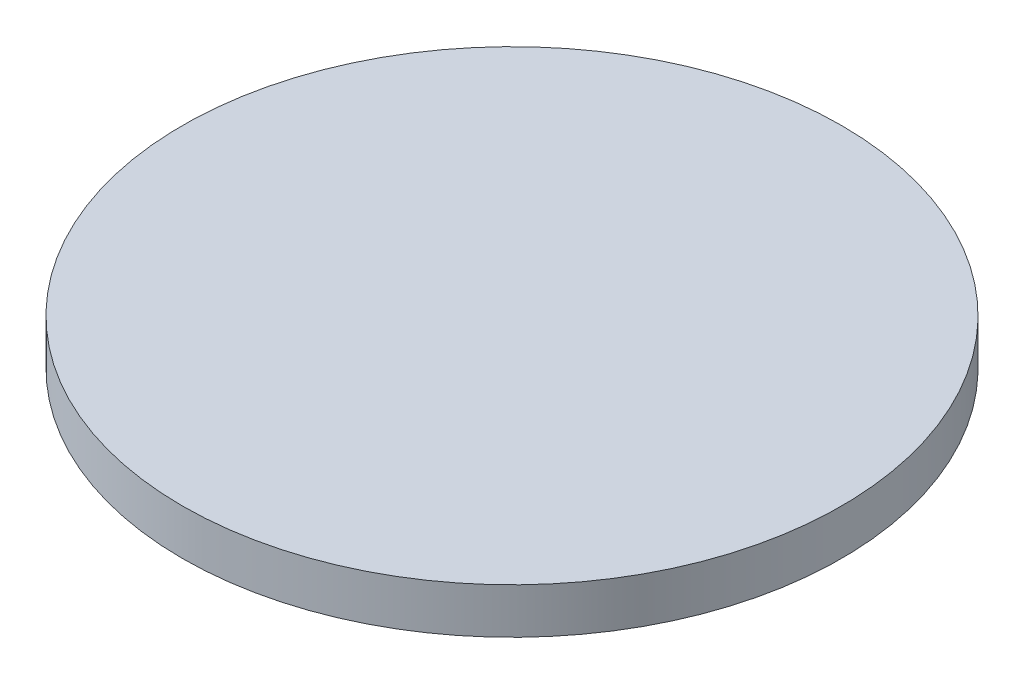
ISO-10303-21;
HEADER;
FILE_DESCRIPTION(('STEP AP214'),'2;1');
FILE_NAME('part.step','',(''),(''),'','','');
FILE_SCHEMA(('AUTOMOTIVE_DESIGN { 1 0 10303 214 1 1 1 1 }'));
ENDSEC;
DATA;
#1=APPLICATION_CONTEXT('core data for automotive mechanical design processes');
#2=APPLICATION_PROTOCOL_DEFINITION('international standard','automotive_design',2000,#1);
#3=PRODUCT_CONTEXT('',#1,'mechanical');
#4=PRODUCT('Part','Part','',(#3));
#5=PRODUCT_RELATED_PRODUCT_CATEGORY('part','',(#4));
#6=PRODUCT_DEFINITION_FORMATION('','',#4);
#7=PRODUCT_DEFINITION_CONTEXT('part definition',#1,'design');
#8=PRODUCT_DEFINITION('design','',#6,#7);
#9=PRODUCT_DEFINITION_SHAPE('','',#8);
#10=(LENGTH_UNIT() NAMED_UNIT(*) SI_UNIT(.MILLI.,.METRE.));
#11=(NAMED_UNIT(*) PLANE_ANGLE_UNIT() SI_UNIT($,.RADIAN.));
#12=(NAMED_UNIT(*) SI_UNIT($,.STERADIAN.) SOLID_ANGLE_UNIT());
#13=UNCERTAINTY_MEASURE_WITH_UNIT(LENGTH_MEASURE(1.E-05),#10,'distance_accuracy_value','');
#14=(GEOMETRIC_REPRESENTATION_CONTEXT(3) GLOBAL_UNCERTAINTY_ASSIGNED_CONTEXT((#13)) GLOBAL_UNIT_ASSIGNED_CONTEXT((#10,
#11,#12)) REPRESENTATION_CONTEXT('',''));
#15=CARTESIAN_POINT('',(0.,0.,0.));
#16=DIRECTION('',(0.,0.,1.));
#17=DIRECTION('',(1.,0.,0.));
#18=AXIS2_PLACEMENT_3D('',#15,#16,#17);
#19=CARTESIAN_POINT('',(0.,1.5875,0.));
#20=DIRECTION('',(0.,-1.,0.));
#21=DIRECTION('',(0.,0.,-1.));
#22=AXIS2_PLACEMENT_3D('',#19,#20,#21);
#23=CYLINDRICAL_SURFACE('',#22,11.5);
#24=CARTESIAN_POINT('',(0.,1.5875,0.));
#25=DIRECTION('',(0.,1.,0.));
#26=DIRECTION('',(0.,0.,1.));
#27=AXIS2_PLACEMENT_3D('',#24,#25,#26);
#28=CIRCLE('',#27,11.5);
#29=CARTESIAN_POINT('',(0.,1.5875,11.5));
#30=VERTEX_POINT('',#29);
#31=EDGE_CURVE('E10',#30,#30,#28,.T.);
#32=ORIENTED_EDGE('',*,*,#31,.F.);
#33=EDGE_LOOP('',(#32));
#34=FACE_BOUND('',#33,.T.);
#35=CARTESIAN_POINT('',(0.,0.,0.));
#36=DIRECTION('',(0.,1.,0.));
#37=DIRECTION('',(0.,0.,1.));
#38=AXIS2_PLACEMENT_3D('',#35,#36,#37);
#39=CIRCLE('',#38,11.5);
#40=CARTESIAN_POINT('',(0.,0.,11.5));
#41=VERTEX_POINT('',#40);
#42=EDGE_CURVE('E42',#41,#41,#39,.T.);
#43=ORIENTED_EDGE('',*,*,#42,.T.);
#44=EDGE_LOOP('',(#43));
#45=FACE_BOUND('',#44,.T.);
#46=ADVANCED_FACE('F39',(#34,#45),#23,.T.);
#47=CARTESIAN_POINT('',(0.,1.5875,0.));
#48=DIRECTION('',(0.,1.,0.));
#49=DIRECTION('',(0.,0.,1.));
#50=AXIS2_PLACEMENT_3D('',#47,#48,#49);
#51=PLANE('',#50);
#52=ORIENTED_EDGE('',*,*,#31,.T.);
#53=EDGE_LOOP('',(#52));
#54=FACE_BOUND('',#53,.T.);
#55=ADVANCED_FACE('F54',(#54),#51,.T.);
#56=CARTESIAN_POINT('',(0.,0.,0.));
#57=DIRECTION('',(0.,1.,0.));
#58=DIRECTION('',(0.,0.,1.));
#59=AXIS2_PLACEMENT_3D('',#56,#57,#58);
#60=PLANE('',#59);
#61=ORIENTED_EDGE('',*,*,#42,.F.);
#62=EDGE_LOOP('',(#61));
#63=FACE_BOUND('',#62,.T.);
#64=ADVANCED_FACE('F52',(#63),#60,.F.);
#65=CLOSED_SHELL('',(#46,#55,#64));
#66=MANIFOLD_SOLID_BREP('B2',#65);
#67=ADVANCED_BREP_SHAPE_REPRESENTATION('',(#18,#66),#14);
#68=SHAPE_DEFINITION_REPRESENTATION(#9,#67);
ENDSEC;
END-ISO-10303-21;
